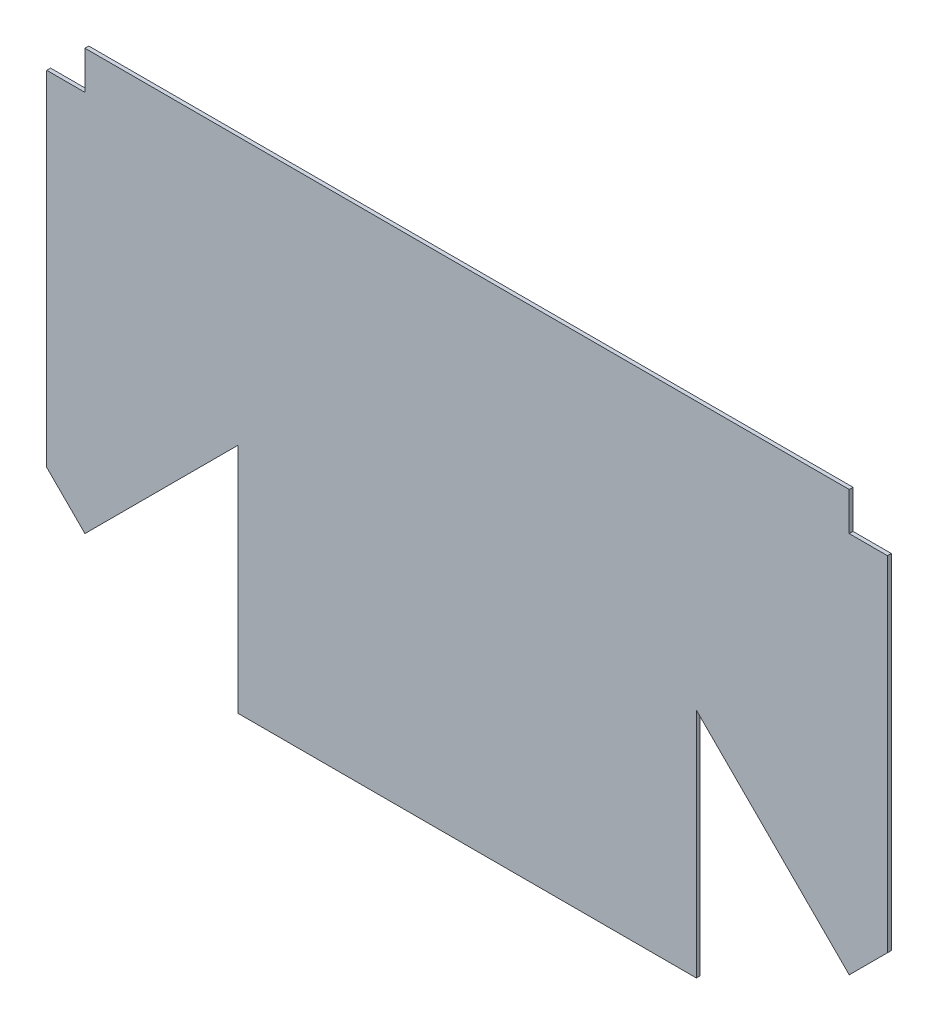
ISO-10303-21;
HEADER;
FILE_DESCRIPTION(('STEP AP214'),'2;1');
FILE_NAME('part.step','',(''),(''),'','','');
FILE_SCHEMA(('AUTOMOTIVE_DESIGN { 1 0 10303 214 1 1 1 1 }'));
ENDSEC;
DATA;
#1=APPLICATION_CONTEXT('core data for automotive mechanical design processes');
#2=APPLICATION_PROTOCOL_DEFINITION('international standard','automotive_design',2000,#1);
#3=PRODUCT_CONTEXT('',#1,'mechanical');
#4=PRODUCT('Part','Part','',(#3));
#5=PRODUCT_RELATED_PRODUCT_CATEGORY('part','',(#4));
#6=PRODUCT_DEFINITION_FORMATION('','',#4);
#7=PRODUCT_DEFINITION_CONTEXT('part definition',#1,'design');
#8=PRODUCT_DEFINITION('design','',#6,#7);
#9=PRODUCT_DEFINITION_SHAPE('','',#8);
#10=(LENGTH_UNIT() NAMED_UNIT(*) SI_UNIT(.MILLI.,.METRE.));
#11=(NAMED_UNIT(*) PLANE_ANGLE_UNIT() SI_UNIT($,.RADIAN.));
#12=(NAMED_UNIT(*) SI_UNIT($,.STERADIAN.) SOLID_ANGLE_UNIT());
#13=UNCERTAINTY_MEASURE_WITH_UNIT(LENGTH_MEASURE(1.E-05),#10,'distance_accuracy_value','');
#14=(GEOMETRIC_REPRESENTATION_CONTEXT(3) GLOBAL_UNCERTAINTY_ASSIGNED_CONTEXT((#13)) GLOBAL_UNIT_ASSIGNED_CONTEXT((#10,
#11,#12)) REPRESENTATION_CONTEXT('',''));
#15=CARTESIAN_POINT('',(0.,0.,0.));
#16=DIRECTION('',(0.,0.,1.));
#17=DIRECTION('',(1.,0.,0.));
#18=AXIS2_PLACEMENT_3D('',#15,#16,#17);
#19=CARTESIAN_POINT('',(-170.,0.,1.));
#20=DIRECTION('',(1.,0.,0.));
#21=DIRECTION('',(0.,0.,-1.));
#22=AXIS2_PLACEMENT_3D('',#19,#20,#21);
#23=PLANE('',#22);
#24=DIRECTION('',(0.,-1.,0.));
#25=VECTOR('',#24,1.);
#26=CARTESIAN_POINT('',(-170.,0.,0.));
#27=LINE('',#26,#25);
#28=CARTESIAN_POINT('',(-170.,-60.,0.));
#29=VERTEX_POINT('',#28);
#30=CARTESIAN_POINT('',(-170.,-120.710678118655,0.));
#31=VERTEX_POINT('',#30);
#32=EDGE_CURVE('E166',#29,#31,#27,.T.);
#33=ORIENTED_EDGE('',*,*,#32,.T.);
#34=DIRECTION('',(0.,0.,-1.));
#35=VECTOR('',#34,1.);
#36=CARTESIAN_POINT('',(-170.,-120.710678118655,1.));
#37=LINE('',#36,#35);
#38=CARTESIAN_POINT('',(-170.,-120.710678118655,1.));
#39=VERTEX_POINT('',#38);
#40=EDGE_CURVE('E11',#39,#31,#37,.T.);
#41=ORIENTED_EDGE('',*,*,#40,.F.);
#42=DIRECTION('',(0.,-1.,0.));
#43=VECTOR('',#42,1.);
#44=CARTESIAN_POINT('',(-170.,0.,1.));
#45=LINE('',#44,#43);
#46=CARTESIAN_POINT('',(-170.,-60.,1.));
#47=VERTEX_POINT('',#46);
#48=EDGE_CURVE('E199',#47,#39,#45,.T.);
#49=ORIENTED_EDGE('',*,*,#48,.F.);
#50=DIRECTION('',(0.,0.,-1.));
#51=VECTOR('',#50,1.);
#52=CARTESIAN_POINT('',(-170.,-60.,1.));
#53=LINE('',#52,#51);
#54=EDGE_CURVE('E162',#47,#29,#53,.T.);
#55=ORIENTED_EDGE('',*,*,#54,.T.);
#56=EDGE_LOOP('',(#33,#41,#49,#55));
#57=FACE_BOUND('',#56,.T.);
#58=ADVANCED_FACE('F35',(#57),#23,.F.);
#59=CARTESIAN_POINT('',(0.,-120.710678118655,1.));
#60=DIRECTION('',(0.,1.,0.));
#61=DIRECTION('',(0.,0.,1.));
#62=AXIS2_PLACEMENT_3D('',#59,#60,#61);
#63=PLANE('',#62);
#64=DIRECTION('',(1.,0.,0.));
#65=VECTOR('',#64,1.);
#66=CARTESIAN_POINT('',(0.,-120.710678118655,0.));
#67=LINE('',#66,#65);
#68=CARTESIAN_POINT('',(-50.,-120.710678118655,0.));
#69=VERTEX_POINT('',#68);
#70=EDGE_CURVE('E169',#31,#69,#67,.T.);
#71=ORIENTED_EDGE('',*,*,#70,.T.);
#72=DIRECTION('',(0.,0.,-1.));
#73=VECTOR('',#72,1.);
#74=CARTESIAN_POINT('',(-50.,-120.710678118655,1.));
#75=LINE('',#74,#73);
#76=CARTESIAN_POINT('',(-50.,-120.710678118655,1.));
#77=VERTEX_POINT('',#76);
#78=EDGE_CURVE('E43',#77,#69,#75,.T.);
#79=ORIENTED_EDGE('',*,*,#78,.F.);
#80=DIRECTION('',(1.,0.,0.));
#81=VECTOR('',#80,1.);
#82=CARTESIAN_POINT('',(0.,-120.710678118655,1.));
#83=LINE('',#82,#81);
#84=EDGE_CURVE('E112',#39,#77,#83,.T.);
#85=ORIENTED_EDGE('',*,*,#84,.F.);
#86=ORIENTED_EDGE('',*,*,#40,.T.);
#87=EDGE_LOOP('',(#71,#79,#85,#86));
#88=FACE_BOUND('',#87,.T.);
#89=ADVANCED_FACE('F227',(#88),#63,.F.);
#90=CARTESIAN_POINT('',(-50.,0.,1.));
#91=DIRECTION('',(1.,0.,0.));
#92=DIRECTION('',(0.,0.,-1.));
#93=AXIS2_PLACEMENT_3D('',#90,#91,#92);
#94=PLANE('',#93);
#95=DIRECTION('',(0.,-1.,0.));
#96=VECTOR('',#95,1.);
#97=CARTESIAN_POINT('',(-50.,0.,0.));
#98=LINE('',#97,#96);
#99=CARTESIAN_POINT('',(-50.,-60.,0.));
#100=VERTEX_POINT('',#99);
#101=EDGE_CURVE('E172',#100,#69,#98,.T.);
#102=ORIENTED_EDGE('',*,*,#101,.F.);
#103=DIRECTION('',(0.,0.,-1.));
#104=VECTOR('',#103,1.);
#105=CARTESIAN_POINT('',(-50.,-60.,1.));
#106=LINE('',#105,#104);
#107=CARTESIAN_POINT('',(-50.,-60.,1.));
#108=VERTEX_POINT('',#107);
#109=EDGE_CURVE('E220',#108,#100,#106,.T.);
#110=ORIENTED_EDGE('',*,*,#109,.F.);
#111=DIRECTION('',(0.,-1.,0.));
#112=VECTOR('',#111,1.);
#113=CARTESIAN_POINT('',(-50.,0.,1.));
#114=LINE('',#113,#112);
#115=EDGE_CURVE('E226',#108,#77,#114,.T.);
#116=ORIENTED_EDGE('',*,*,#115,.T.);
#117=ORIENTED_EDGE('',*,*,#78,.T.);
#118=EDGE_LOOP('',(#102,#110,#116,#117));
#119=FACE_BOUND('',#118,.T.);
#120=ADVANCED_FACE('F224',(#119),#94,.T.);
#121=CARTESIAN_POINT('',(-55.,-55.,1.));
#122=DIRECTION('',(-0.707106781186548,-0.707106781186547,0.));
#123=DIRECTION('',(0.707106781186547,-0.707106781186548,0.));
#124=AXIS2_PLACEMENT_3D('',#121,#122,#123);
#125=PLANE('',#124);
#126=DIRECTION('',(-0.707106781186547,0.707106781186548,0.));
#127=VECTOR('',#126,1.);
#128=CARTESIAN_POINT('',(-55.,-55.,0.));
#129=LINE('',#128,#127);
#130=CARTESIAN_POINT('',(-9.99999999999999,-100.,0.));
#131=VERTEX_POINT('',#130);
#132=EDGE_CURVE('E175',#131,#100,#129,.T.);
#133=ORIENTED_EDGE('',*,*,#132,.F.);
#134=DIRECTION('',(0.,0.,-1.));
#135=VECTOR('',#134,1.);
#136=CARTESIAN_POINT('',(-9.99999999999999,-100.,1.));
#137=LINE('',#136,#135);
#138=CARTESIAN_POINT('',(-9.99999999999999,-100.,1.));
#139=VERTEX_POINT('',#138);
#140=EDGE_CURVE('E218',#139,#131,#137,.T.);
#141=ORIENTED_EDGE('',*,*,#140,.F.);
#142=DIRECTION('',(-0.707106781186547,0.707106781186548,0.));
#143=VECTOR('',#142,1.);
#144=CARTESIAN_POINT('',(-55.,-55.,1.));
#145=LINE('',#144,#143);
#146=EDGE_CURVE('E238',#139,#108,#145,.T.);
#147=ORIENTED_EDGE('',*,*,#146,.T.);
#148=ORIENTED_EDGE('',*,*,#109,.T.);
#149=EDGE_LOOP('',(#133,#141,#147,#148));
#150=FACE_BOUND('',#149,.T.);
#151=ADVANCED_FACE('F235',(#150),#125,.T.);
#152=CARTESIAN_POINT('',(45.,-44.9999999999997,1.));
#153=DIRECTION('',(0.70710678118655,-0.707106781186545,0.));
#154=DIRECTION('',(0.707106781186545,0.70710678118655,0.));
#155=AXIS2_PLACEMENT_3D('',#152,#153,#154);
#156=PLANE('',#155);
#157=DIRECTION('',(-0.707106781186545,-0.70710678118655,0.));
#158=VECTOR('',#157,1.);
#159=CARTESIAN_POINT('',(45.,-44.9999999999997,0.));
#160=LINE('',#159,#158);
#161=CARTESIAN_POINT('',(0.,-89.9999999999999,0.));
#162=VERTEX_POINT('',#161);
#163=EDGE_CURVE('E178',#162,#131,#160,.T.);
#164=ORIENTED_EDGE('',*,*,#163,.F.);
#165=DIRECTION('',(0.,0.,-1.));
#166=VECTOR('',#165,1.);
#167=CARTESIAN_POINT('',(0.,-89.9999999999999,1.));
#168=LINE('',#167,#166);
#169=CARTESIAN_POINT('',(0.,-89.9999999999999,1.));
#170=VERTEX_POINT('',#169);
#171=EDGE_CURVE('E216',#170,#162,#168,.T.);
#172=ORIENTED_EDGE('',*,*,#171,.F.);
#173=DIRECTION('',(-0.707106781186545,-0.70710678118655,0.));
#174=VECTOR('',#173,1.);
#175=CARTESIAN_POINT('',(45.,-44.9999999999997,1.));
#176=LINE('',#175,#174);
#177=EDGE_CURVE('E242',#170,#139,#176,.T.);
#178=ORIENTED_EDGE('',*,*,#177,.T.);
#179=ORIENTED_EDGE('',*,*,#140,.T.);
#180=EDGE_LOOP('',(#164,#172,#178,#179));
#181=FACE_BOUND('',#180,.T.);
#182=ADVANCED_FACE('F286',(#181),#156,.T.);
#183=CARTESIAN_POINT('',(0.,0.,1.));
#184=DIRECTION('',(1.,0.,0.));
#185=DIRECTION('',(0.,1.,0.));
#186=AXIS2_PLACEMENT_3D('',#183,#184,#185);
#187=PLANE('',#186);
#188=DIRECTION('',(0.,-1.,0.));
#189=VECTOR('',#188,1.);
#190=CARTESIAN_POINT('',(0.,0.,0.));
#191=LINE('',#190,#189);
#192=CARTESIAN_POINT('',(0.,0.,0.));
#193=VERTEX_POINT('',#192);
#194=EDGE_CURVE('E181',#193,#162,#191,.T.);
#195=ORIENTED_EDGE('',*,*,#194,.F.);
#196=DIRECTION('',(0.,0.,-1.));
#197=VECTOR('',#196,1.);
#198=CARTESIAN_POINT('',(0.,0.,1.));
#199=LINE('',#198,#197);
#200=CARTESIAN_POINT('',(0.,0.,1.));
#201=VERTEX_POINT('',#200);
#202=EDGE_CURVE('E214',#201,#193,#199,.T.);
#203=ORIENTED_EDGE('',*,*,#202,.F.);
#204=DIRECTION('',(0.,-1.,0.));
#205=VECTOR('',#204,1.);
#206=CARTESIAN_POINT('',(0.,0.,1.));
#207=LINE('',#206,#205);
#208=EDGE_CURVE('E248',#201,#170,#207,.T.);
#209=ORIENTED_EDGE('',*,*,#208,.T.);
#210=ORIENTED_EDGE('',*,*,#171,.T.);
#211=EDGE_LOOP('',(#195,#203,#209,#210));
#212=FACE_BOUND('',#211,.T.);
#213=ADVANCED_FACE('F289',(#212),#187,.T.);
#214=CARTESIAN_POINT('',(0.,0.,1.));
#215=DIRECTION('',(0.,-1.,0.));
#216=DIRECTION('',(1.,0.,0.));
#217=AXIS2_PLACEMENT_3D('',#214,#215,#216);
#218=PLANE('',#217);
#219=DIRECTION('',(-1.,0.,0.));
#220=VECTOR('',#219,1.);
#221=CARTESIAN_POINT('',(0.,0.,0.));
#222=LINE('',#221,#220);
#223=CARTESIAN_POINT('',(-10.,0.,0.));
#224=VERTEX_POINT('',#223);
#225=EDGE_CURVE('E184',#193,#224,#222,.T.);
#226=ORIENTED_EDGE('',*,*,#225,.T.);
#227=DIRECTION('',(0.,0.,-1.));
#228=VECTOR('',#227,1.);
#229=CARTESIAN_POINT('',(-10.,0.,1.));
#230=LINE('',#229,#228);
#231=CARTESIAN_POINT('',(-10.,0.,1.));
#232=VERTEX_POINT('',#231);
#233=EDGE_CURVE('E211',#232,#224,#230,.T.);
#234=ORIENTED_EDGE('',*,*,#233,.F.);
#235=DIRECTION('',(-1.,0.,0.));
#236=VECTOR('',#235,1.);
#237=CARTESIAN_POINT('',(0.,0.,1.));
#238=LINE('',#237,#236);
#239=EDGE_CURVE('E251',#201,#232,#238,.T.);
#240=ORIENTED_EDGE('',*,*,#239,.F.);
#241=ORIENTED_EDGE('',*,*,#202,.T.);
#242=EDGE_LOOP('',(#226,#234,#240,#241));
#243=FACE_BOUND('',#242,.T.);
#244=ADVANCED_FACE('F293',(#243),#218,.F.);
#245=CARTESIAN_POINT('',(-10.,0.,1.));
#246=DIRECTION('',(-1.,0.,0.));
#247=DIRECTION('',(0.,-1.,0.));
#248=AXIS2_PLACEMENT_3D('',#245,#246,#247);
#249=PLANE('',#248);
#250=DIRECTION('',(0.,1.,0.));
#251=VECTOR('',#250,1.);
#252=CARTESIAN_POINT('',(-10.,0.,0.));
#253=LINE('',#252,#251);
#254=CARTESIAN_POINT('',(-10.,10.,0.));
#255=VERTEX_POINT('',#254);
#256=EDGE_CURVE('E186',#224,#255,#253,.T.);
#257=ORIENTED_EDGE('',*,*,#256,.T.);
#258=DIRECTION('',(0.,0.,-1.));
#259=VECTOR('',#258,1.);
#260=CARTESIAN_POINT('',(-10.,10.,1.));
#261=LINE('',#260,#259);
#262=CARTESIAN_POINT('',(-10.,10.,1.));
#263=VERTEX_POINT('',#262);
#264=EDGE_CURVE('E208',#263,#255,#261,.T.);
#265=ORIENTED_EDGE('',*,*,#264,.F.);
#266=DIRECTION('',(0.,1.,0.));
#267=VECTOR('',#266,1.);
#268=CARTESIAN_POINT('',(-10.,0.,1.));
#269=LINE('',#268,#267);
#270=EDGE_CURVE('E253',#232,#263,#269,.T.);
#271=ORIENTED_EDGE('',*,*,#270,.F.);
#272=ORIENTED_EDGE('',*,*,#233,.T.);
#273=EDGE_LOOP('',(#257,#265,#271,#272));
#274=FACE_BOUND('',#273,.T.);
#275=ADVANCED_FACE('F297',(#274),#249,.F.);
#276=CARTESIAN_POINT('',(0.,10.,1.));
#277=DIRECTION('',(0.,-1.,0.));
#278=DIRECTION('',(1.,0.,0.));
#279=AXIS2_PLACEMENT_3D('',#276,#277,#278);
#280=PLANE('',#279);
#281=DIRECTION('',(-1.,0.,0.));
#282=VECTOR('',#281,1.);
#283=CARTESIAN_POINT('',(0.,10.,0.));
#284=LINE('',#283,#282);
#285=CARTESIAN_POINT('',(-210.,9.99999999999998,0.));
#286=VERTEX_POINT('',#285);
#287=EDGE_CURVE('E188',#255,#286,#284,.T.);
#288=ORIENTED_EDGE('',*,*,#287,.T.);
#289=DIRECTION('',(0.,0.,-1.));
#290=VECTOR('',#289,1.);
#291=CARTESIAN_POINT('',(-210.,9.99999999999998,1.));
#292=LINE('',#291,#290);
#293=CARTESIAN_POINT('',(-210.,9.99999999999998,1.));
#294=VERTEX_POINT('',#293);
#295=EDGE_CURVE('E205',#294,#286,#292,.T.);
#296=ORIENTED_EDGE('',*,*,#295,.F.);
#297=DIRECTION('',(-1.,0.,0.));
#298=VECTOR('',#297,1.);
#299=CARTESIAN_POINT('',(0.,10.,1.));
#300=LINE('',#299,#298);
#301=EDGE_CURVE('E255',#263,#294,#300,.T.);
#302=ORIENTED_EDGE('',*,*,#301,.F.);
#303=ORIENTED_EDGE('',*,*,#264,.T.);
#304=EDGE_LOOP('',(#288,#296,#302,#303));
#305=FACE_BOUND('',#304,.T.);
#306=ADVANCED_FACE('F301',(#305),#280,.F.);
#307=CARTESIAN_POINT('',(-210.,5.82867087928209E-13,1.));
#308=DIRECTION('',(1.,0.,0.));
#309=DIRECTION('',(0.,1.,0.));
#310=AXIS2_PLACEMENT_3D('',#307,#308,#309);
#311=PLANE('',#310);
#312=DIRECTION('',(0.,-1.,0.));
#313=VECTOR('',#312,1.);
#314=CARTESIAN_POINT('',(-210.,5.82867087928209E-13,0.));
#315=LINE('',#314,#313);
#316=CARTESIAN_POINT('',(-210.,0.,0.));
#317=VERTEX_POINT('',#316);
#318=EDGE_CURVE('E190',#286,#317,#315,.T.);
#319=ORIENTED_EDGE('',*,*,#318,.T.);
#320=DIRECTION('',(0.,0.,-1.));
#321=VECTOR('',#320,1.);
#322=CARTESIAN_POINT('',(-210.,0.,1.));
#323=LINE('',#322,#321);
#324=CARTESIAN_POINT('',(-210.,0.,1.));
#325=VERTEX_POINT('',#324);
#326=EDGE_CURVE('E203',#325,#317,#323,.T.);
#327=ORIENTED_EDGE('',*,*,#326,.F.);
#328=DIRECTION('',(0.,-1.,0.));
#329=VECTOR('',#328,1.);
#330=CARTESIAN_POINT('',(-210.,5.82867087928209E-13,1.));
#331=LINE('',#330,#329);
#332=EDGE_CURVE('E257',#294,#325,#331,.T.);
#333=ORIENTED_EDGE('',*,*,#332,.F.);
#334=ORIENTED_EDGE('',*,*,#295,.T.);
#335=EDGE_LOOP('',(#319,#327,#333,#334));
#336=FACE_BOUND('',#335,.T.);
#337=ADVANCED_FACE('F305',(#336),#311,.F.);
#338=CARTESIAN_POINT('',(0.,0.,1.));
#339=DIRECTION('',(0.,1.,0.));
#340=DIRECTION('',(-1.,0.,0.));
#341=AXIS2_PLACEMENT_3D('',#338,#339,#340);
#342=PLANE('',#341);
#343=DIRECTION('',(1.,0.,0.));
#344=VECTOR('',#343,1.);
#345=CARTESIAN_POINT('',(0.,0.,0.));
#346=LINE('',#345,#344);
#347=CARTESIAN_POINT('',(-220.,0.,0.));
#348=VERTEX_POINT('',#347);
#349=EDGE_CURVE('E193',#348,#317,#346,.T.);
#350=ORIENTED_EDGE('',*,*,#349,.F.);
#351=DIRECTION('',(0.,0.,-1.));
#352=VECTOR('',#351,1.);
#353=CARTESIAN_POINT('',(-220.,0.,1.));
#354=LINE('',#353,#352);
#355=CARTESIAN_POINT('',(-220.,0.,1.));
#356=VERTEX_POINT('',#355);
#357=EDGE_CURVE('E157',#356,#348,#354,.T.);
#358=ORIENTED_EDGE('',*,*,#357,.F.);
#359=DIRECTION('',(1.,0.,0.));
#360=VECTOR('',#359,1.);
#361=CARTESIAN_POINT('',(0.,0.,1.));
#362=LINE('',#361,#360);
#363=EDGE_CURVE('E150',#356,#325,#362,.T.);
#364=ORIENTED_EDGE('',*,*,#363,.T.);
#365=ORIENTED_EDGE('',*,*,#326,.T.);
#366=EDGE_LOOP('',(#350,#358,#364,#365));
#367=FACE_BOUND('',#366,.T.);
#368=ADVANCED_FACE('F260',(#367),#342,.T.);
#369=CARTESIAN_POINT('',(-220.,0.,1.));
#370=DIRECTION('',(1.,0.,0.));
#371=DIRECTION('',(0.,0.,-1.));
#372=AXIS2_PLACEMENT_3D('',#369,#370,#371);
#373=PLANE('',#372);
#374=DIRECTION('',(0.,-1.,0.));
#375=VECTOR('',#374,1.);
#376=CARTESIAN_POINT('',(-220.,0.,0.));
#377=LINE('',#376,#375);
#378=CARTESIAN_POINT('',(-220.,-89.9999999999999,0.));
#379=VERTEX_POINT('',#378);
#380=EDGE_CURVE('E156',#348,#379,#377,.T.);
#381=ORIENTED_EDGE('',*,*,#380,.T.);
#382=DIRECTION('',(0.,0.,-1.));
#383=VECTOR('',#382,1.);
#384=CARTESIAN_POINT('',(-220.,-89.9999999999999,1.));
#385=LINE('',#384,#383);
#386=CARTESIAN_POINT('',(-220.,-89.9999999999999,1.));
#387=VERTEX_POINT('',#386);
#388=EDGE_CURVE('E153',#387,#379,#385,.T.);
#389=ORIENTED_EDGE('',*,*,#388,.F.);
#390=DIRECTION('',(0.,-1.,0.));
#391=VECTOR('',#390,1.);
#392=CARTESIAN_POINT('',(-220.,0.,1.));
#393=LINE('',#392,#391);
#394=EDGE_CURVE('E144',#356,#387,#393,.T.);
#395=ORIENTED_EDGE('',*,*,#394,.F.);
#396=ORIENTED_EDGE('',*,*,#357,.T.);
#397=EDGE_LOOP('',(#381,#389,#395,#396));
#398=FACE_BOUND('',#397,.T.);
#399=ADVANCED_FACE('F154',(#398),#373,.F.);
#400=CARTESIAN_POINT('',(-155.000000000001,-155.,1.));
#401=DIRECTION('',(0.707106781186549,0.707106781186546,0.));
#402=DIRECTION('',(-0.707106781186546,0.707106781186549,0.));
#403=AXIS2_PLACEMENT_3D('',#400,#401,#402);
#404=PLANE('',#403);
#405=DIRECTION('',(0.707106781186546,-0.707106781186549,0.));
#406=VECTOR('',#405,1.);
#407=CARTESIAN_POINT('',(-155.000000000001,-155.,0.));
#408=LINE('',#407,#406);
#409=CARTESIAN_POINT('',(-210.,-100.,0.));
#410=VERTEX_POINT('',#409);
#411=EDGE_CURVE('E98',#379,#410,#408,.T.);
#412=ORIENTED_EDGE('',*,*,#411,.T.);
#413=DIRECTION('',(0.,0.,-1.));
#414=VECTOR('',#413,1.);
#415=CARTESIAN_POINT('',(-210.,-100.,1.));
#416=LINE('',#415,#414);
#417=CARTESIAN_POINT('',(-210.,-100.,1.));
#418=VERTEX_POINT('',#417);
#419=EDGE_CURVE('E158',#418,#410,#416,.T.);
#420=ORIENTED_EDGE('',*,*,#419,.F.);
#421=DIRECTION('',(0.707106781186546,-0.707106781186549,0.));
#422=VECTOR('',#421,1.);
#423=CARTESIAN_POINT('',(-155.000000000001,-155.,1.));
#424=LINE('',#423,#422);
#425=EDGE_CURVE('E148',#387,#418,#424,.T.);
#426=ORIENTED_EDGE('',*,*,#425,.F.);
#427=ORIENTED_EDGE('',*,*,#388,.T.);
#428=EDGE_LOOP('',(#412,#420,#426,#427));
#429=FACE_BOUND('',#428,.T.);
#430=ADVANCED_FACE('F160',(#429),#404,.F.);
#431=CARTESIAN_POINT('',(-55.0000000000001,55.0000000000001,1.));
#432=DIRECTION('',(-0.707106781186548,0.707106781186547,0.));
#433=DIRECTION('',(-0.707106781186547,-0.707106781186548,0.));
#434=AXIS2_PLACEMENT_3D('',#431,#432,#433);
#435=PLANE('',#434);
#436=DIRECTION('',(0.707106781186547,0.707106781186548,0.));
#437=VECTOR('',#436,1.);
#438=CARTESIAN_POINT('',(-55.0000000000001,55.0000000000001,0.));
#439=LINE('',#438,#437);
#440=EDGE_CURVE('E104',#410,#29,#439,.T.);
#441=ORIENTED_EDGE('',*,*,#440,.T.);
#442=ORIENTED_EDGE('',*,*,#54,.F.);
#443=DIRECTION('',(0.707106781186547,0.707106781186548,0.));
#444=VECTOR('',#443,1.);
#445=CARTESIAN_POINT('',(-55.0000000000001,55.0000000000001,1.));
#446=LINE('',#445,#444);
#447=EDGE_CURVE('E51',#418,#47,#446,.T.);
#448=ORIENTED_EDGE('',*,*,#447,.F.);
#449=ORIENTED_EDGE('',*,*,#419,.T.);
#450=EDGE_LOOP('',(#441,#442,#448,#449));
#451=FACE_BOUND('',#450,.T.);
#452=ADVANCED_FACE('F265',(#451),#435,.F.);
#453=CARTESIAN_POINT('',(0.,0.,1.));
#454=DIRECTION('',(0.,0.,1.));
#455=DIRECTION('',(1.,0.,0.));
#456=AXIS2_PLACEMENT_3D('',#453,#454,#455);
#457=PLANE('',#456);
#458=ORIENTED_EDGE('',*,*,#48,.T.);
#459=ORIENTED_EDGE('',*,*,#84,.T.);
#460=ORIENTED_EDGE('',*,*,#115,.F.);
#461=ORIENTED_EDGE('',*,*,#146,.F.);
#462=ORIENTED_EDGE('',*,*,#177,.F.);
#463=ORIENTED_EDGE('',*,*,#208,.F.);
#464=ORIENTED_EDGE('',*,*,#239,.T.);
#465=ORIENTED_EDGE('',*,*,#270,.T.);
#466=ORIENTED_EDGE('',*,*,#301,.T.);
#467=ORIENTED_EDGE('',*,*,#332,.T.);
#468=ORIENTED_EDGE('',*,*,#363,.F.);
#469=ORIENTED_EDGE('',*,*,#394,.T.);
#470=ORIENTED_EDGE('',*,*,#425,.T.);
#471=ORIENTED_EDGE('',*,*,#447,.T.);
#472=EDGE_LOOP('',(#458,#459,#460,#461,#462,#463,#464,#465,#466,#467,#468,#469,#470,#471));
#473=FACE_BOUND('',#472,.T.);
#474=ADVANCED_FACE('F146',(#473),#457,.T.);
#475=CARTESIAN_POINT('',(0.,0.,0.));
#476=DIRECTION('',(0.,0.,1.));
#477=DIRECTION('',(1.,0.,0.));
#478=AXIS2_PLACEMENT_3D('',#475,#476,#477);
#479=PLANE('',#478);
#480=ORIENTED_EDGE('',*,*,#32,.F.);
#481=ORIENTED_EDGE('',*,*,#440,.F.);
#482=ORIENTED_EDGE('',*,*,#411,.F.);
#483=ORIENTED_EDGE('',*,*,#380,.F.);
#484=ORIENTED_EDGE('',*,*,#349,.T.);
#485=ORIENTED_EDGE('',*,*,#318,.F.);
#486=ORIENTED_EDGE('',*,*,#287,.F.);
#487=ORIENTED_EDGE('',*,*,#256,.F.);
#488=ORIENTED_EDGE('',*,*,#225,.F.);
#489=ORIENTED_EDGE('',*,*,#194,.T.);
#490=ORIENTED_EDGE('',*,*,#163,.T.);
#491=ORIENTED_EDGE('',*,*,#132,.T.);
#492=ORIENTED_EDGE('',*,*,#101,.T.);
#493=ORIENTED_EDGE('',*,*,#70,.F.);
#494=EDGE_LOOP('',(#480,#481,#482,#483,#484,#485,#486,#487,#488,#489,#490,#491,#492,#493));
#495=FACE_BOUND('',#494,.T.);
#496=ADVANCED_FACE('F231',(#495),#479,.F.);
#497=CLOSED_SHELL('',(#58,#89,#120,#151,#182,#213,#244,#275,#306,#337,#368,#399,#430,#452,#474,#496));
#498=MANIFOLD_SOLID_BREP('B2',#497);
#499=ADVANCED_BREP_SHAPE_REPRESENTATION('',(#18,#498),#14);
#500=SHAPE_DEFINITION_REPRESENTATION(#9,#499);
ENDSEC;
END-ISO-10303-21;
